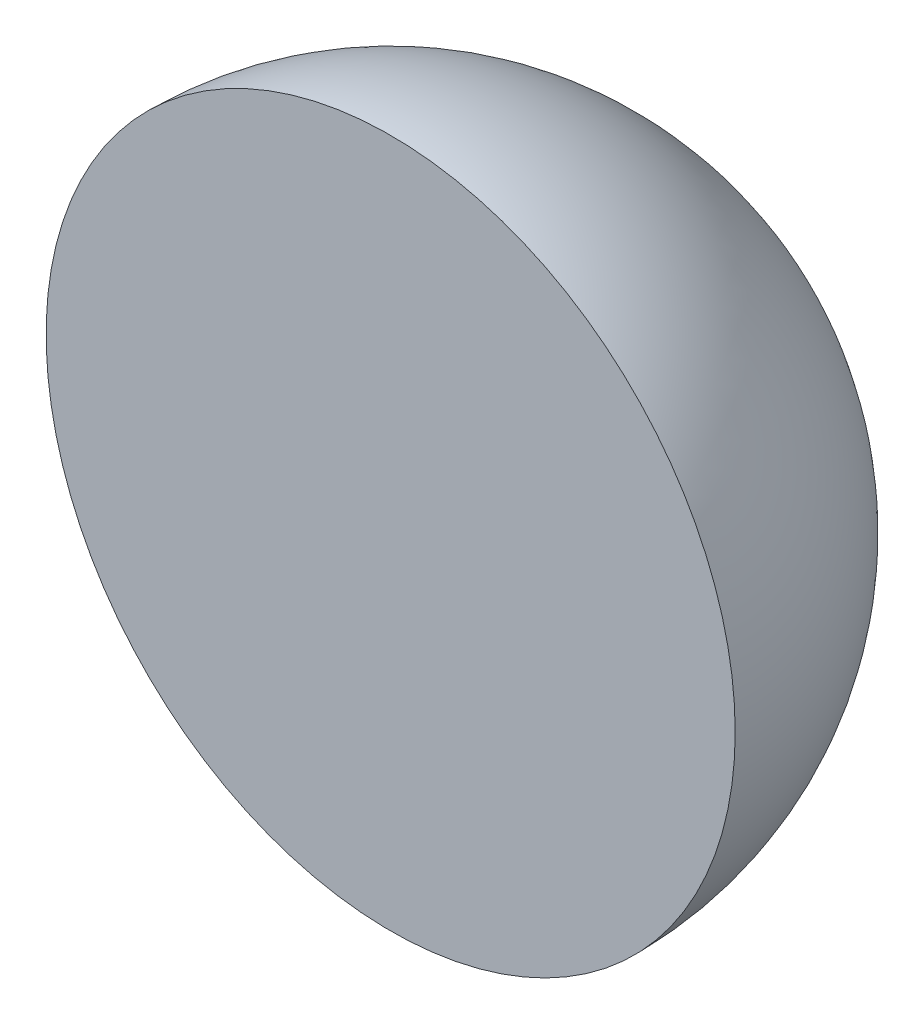
ISO-10303-21;
HEADER;
FILE_DESCRIPTION(('STEP AP214'),'2;1');
FILE_NAME('part.step','',(''),(''),'','','');
FILE_SCHEMA(('AUTOMOTIVE_DESIGN { 1 0 10303 214 1 1 1 1 }'));
ENDSEC;
DATA;
#1=APPLICATION_CONTEXT('core data for automotive mechanical design processes');
#2=APPLICATION_PROTOCOL_DEFINITION('international standard','automotive_design',2000,#1);
#3=PRODUCT_CONTEXT('',#1,'mechanical');
#4=PRODUCT('Part','Part','',(#3));
#5=PRODUCT_RELATED_PRODUCT_CATEGORY('part','',(#4));
#6=PRODUCT_DEFINITION_FORMATION('','',#4);
#7=PRODUCT_DEFINITION_CONTEXT('part definition',#1,'design');
#8=PRODUCT_DEFINITION('design','',#6,#7);
#9=PRODUCT_DEFINITION_SHAPE('','',#8);
#10=(LENGTH_UNIT() NAMED_UNIT(*) SI_UNIT(.MILLI.,.METRE.));
#11=(NAMED_UNIT(*) PLANE_ANGLE_UNIT() SI_UNIT($,.RADIAN.));
#12=(NAMED_UNIT(*) SI_UNIT($,.STERADIAN.) SOLID_ANGLE_UNIT());
#13=UNCERTAINTY_MEASURE_WITH_UNIT(LENGTH_MEASURE(1.E-05),#10,'distance_accuracy_value','');
#14=(GEOMETRIC_REPRESENTATION_CONTEXT(3) GLOBAL_UNCERTAINTY_ASSIGNED_CONTEXT((#13)) GLOBAL_UNIT_ASSIGNED_CONTEXT((#10,
#11,#12)) REPRESENTATION_CONTEXT('',''));
#15=CARTESIAN_POINT('',(0.,0.,0.));
#16=DIRECTION('',(0.,0.,1.));
#17=DIRECTION('',(1.,0.,0.));
#18=AXIS2_PLACEMENT_3D('',#15,#16,#17);
#19=CARTESIAN_POINT('',(0.,0.,0.));
#20=DIRECTION('',(1.,0.,0.));
#21=DIRECTION('',(0.,1.,0.));
#22=AXIS2_PLACEMENT_3D('',#19,#20,#21);
#23=SPHERICAL_SURFACE('',#22,0.5);
#24=CARTESIAN_POINT('',(0.,0.,0.));
#25=DIRECTION('',(0.,0.,-1.));
#26=DIRECTION('',(1.,0.,0.));
#27=AXIS2_PLACEMENT_3D('',#24,#25,#26);
#28=SPHERICAL_SURFACE('',#27,0.5);
#29=CARTESIAN_POINT('',(0.,0.,0.));
#30=DIRECTION('',(0.,0.,-1.));
#31=DIRECTION('',(1.,0.,0.));
#32=AXIS2_PLACEMENT_3D('',#29,#30,#31);
#33=CIRCLE('',#32,0.5);
#34=CARTESIAN_POINT('',(0.5,0.,0.));
#35=VERTEX_POINT('',#34);
#36=EDGE_CURVE('E10',#35,#35,#33,.T.);
#37=ORIENTED_EDGE('',*,*,#36,.T.);
#38=EDGE_LOOP('',(#37));
#39=FACE_BOUND('',#38,.T.);
#40=ADVANCED_FACE('F37',(#39),#28,.T.);
#41=CARTESIAN_POINT('',(0.,0.,0.));
#42=DIRECTION('',(0.,0.,-1.));
#43=DIRECTION('',(1.,0.,0.));
#44=AXIS2_PLACEMENT_3D('',#41,#42,#43);
#45=PLANE('',#44);
#46=ORIENTED_EDGE('',*,*,#36,.F.);
#47=EDGE_LOOP('',(#46));
#48=FACE_BOUND('',#47,.T.);
#49=ADVANCED_FACE('F46',(#48),#45,.F.);
#50=CLOSED_SHELL('',(#40,#49));
#51=MANIFOLD_SOLID_BREP('B2',#50);
#52=ADVANCED_BREP_SHAPE_REPRESENTATION('',(#18,#51),#14);
#53=SHAPE_DEFINITION_REPRESENTATION(#9,#52);
ENDSEC;
END-ISO-10303-21;
